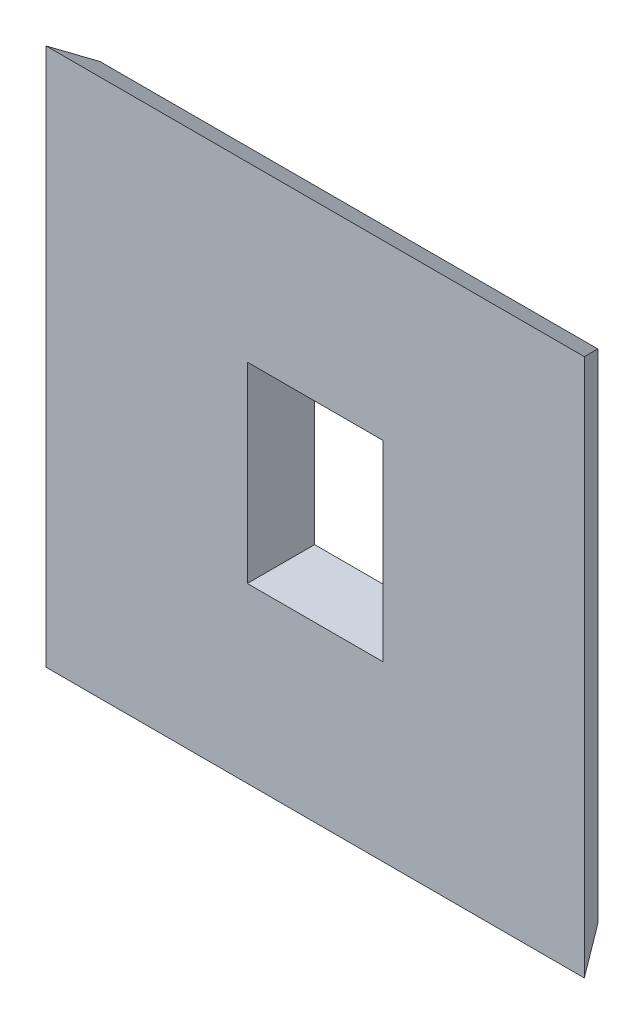
ISO-10303-21;
HEADER;
FILE_DESCRIPTION(('STEP AP214'),'2;1');
FILE_NAME('part.step','',(''),(''),'','','');
FILE_SCHEMA(('AUTOMOTIVE_DESIGN { 1 0 10303 214 1 1 1 1 }'));
ENDSEC;
DATA;
#1=APPLICATION_CONTEXT('core data for automotive mechanical design processes');
#2=APPLICATION_PROTOCOL_DEFINITION('international standard','automotive_design',2000,#1);
#3=PRODUCT_CONTEXT('',#1,'mechanical');
#4=PRODUCT('Part','Part','',(#3));
#5=PRODUCT_RELATED_PRODUCT_CATEGORY('part','',(#4));
#6=PRODUCT_DEFINITION_FORMATION('','',#4);
#7=PRODUCT_DEFINITION_CONTEXT('part definition',#1,'design');
#8=PRODUCT_DEFINITION('design','',#6,#7);
#9=PRODUCT_DEFINITION_SHAPE('','',#8);
#10=(LENGTH_UNIT() NAMED_UNIT(*) SI_UNIT(.MILLI.,.METRE.));
#11=(NAMED_UNIT(*) PLANE_ANGLE_UNIT() SI_UNIT($,.RADIAN.));
#12=(NAMED_UNIT(*) SI_UNIT($,.STERADIAN.) SOLID_ANGLE_UNIT());
#13=UNCERTAINTY_MEASURE_WITH_UNIT(LENGTH_MEASURE(1.E-05),#10,'distance_accuracy_value','');
#14=(GEOMETRIC_REPRESENTATION_CONTEXT(3) GLOBAL_UNCERTAINTY_ASSIGNED_CONTEXT((#13)) GLOBAL_UNIT_ASSIGNED_CONTEXT((#10,
#11,#12)) REPRESENTATION_CONTEXT('',''));
#15=CARTESIAN_POINT('',(0.,0.,0.));
#16=DIRECTION('',(0.,0.,1.));
#17=DIRECTION('',(1.,0.,0.));
#18=AXIS2_PLACEMENT_3D('',#15,#16,#17);
#19=CARTESIAN_POINT('',(-40.,0.,0.));
#20=DIRECTION('',(0.857492925712544,0.,0.514495755427527));
#21=DIRECTION('',(0.,-1.,0.));
#22=AXIS2_PLACEMENT_3D('',#19,#20,#21);
#23=PLANE('',#22);
#24=DIRECTION('',(-0.457495710997814,-0.457495710997814,0.762492851663023));
#25=VECTOR('',#24,1.);
#26=CARTESIAN_POINT('',(-31.6279069767442,-31.6279069767442,-13.953488372093));
#27=LINE('',#26,#25);
#28=CARTESIAN_POINT('',(-40.,-40.,0.));
#29=VERTEX_POINT('',#28);
#30=CARTESIAN_POINT('',(-37.,-37.,-5.));
#31=VERTEX_POINT('',#30);
#32=EDGE_CURVE('E13',#29,#31,#27,.F.);
#33=ORIENTED_EDGE('',*,*,#32,.F.);
#34=DIRECTION('',(0.,1.,0.));
#35=VECTOR('',#34,1.);
#36=CARTESIAN_POINT('',(-40.,0.,0.));
#37=LINE('',#36,#35);
#38=CARTESIAN_POINT('',(-40.,40.,0.));
#39=VERTEX_POINT('',#38);
#40=EDGE_CURVE('E200',#29,#39,#37,.T.);
#41=ORIENTED_EDGE('',*,*,#40,.T.);
#42=DIRECTION('',(0.457495710997814,-0.457495710997814,-0.762492851663023));
#43=VECTOR('',#42,1.);
#44=CARTESIAN_POINT('',(-31.6279069767442,31.6279069767442,-13.953488372093));
#45=LINE('',#44,#43);
#46=CARTESIAN_POINT('',(-37.,37.,-5.));
#47=VERTEX_POINT('',#46);
#48=EDGE_CURVE('E56',#39,#47,#45,.T.);
#49=ORIENTED_EDGE('',*,*,#48,.T.);
#50=DIRECTION('',(0.,1.,0.));
#51=VECTOR('',#50,1.);
#52=CARTESIAN_POINT('',(-37.,0.,-5.));
#53=LINE('',#52,#51);
#54=EDGE_CURVE('E163',#31,#47,#53,.T.);
#55=ORIENTED_EDGE('',*,*,#54,.F.);
#56=EDGE_LOOP('',(#33,#41,#49,#55));
#57=FACE_BOUND('',#56,.T.);
#58=ADVANCED_FACE('F47',(#57),#23,.F.);
#59=CARTESIAN_POINT('',(0.,40.,0.));
#60=DIRECTION('',(0.,-0.857492925712544,0.514495755427527));
#61=DIRECTION('',(-1.,0.,0.));
#62=AXIS2_PLACEMENT_3D('',#59,#60,#61);
#63=PLANE('',#62);
#64=ORIENTED_EDGE('',*,*,#48,.F.);
#65=DIRECTION('',(1.,0.,0.));
#66=VECTOR('',#65,1.);
#67=CARTESIAN_POINT('',(0.,40.,0.));
#68=LINE('',#67,#66);
#69=CARTESIAN_POINT('',(40.,40.,0.));
#70=VERTEX_POINT('',#69);
#71=EDGE_CURVE('E212',#39,#70,#68,.T.);
#72=ORIENTED_EDGE('',*,*,#71,.T.);
#73=DIRECTION('',(0.457495710997814,0.457495710997814,0.762492851663023));
#74=VECTOR('',#73,1.);
#75=CARTESIAN_POINT('',(31.6279069767442,31.6279069767442,-13.953488372093));
#76=LINE('',#75,#74);
#77=CARTESIAN_POINT('',(37.,37.,-5.));
#78=VERTEX_POINT('',#77);
#79=EDGE_CURVE('E71',#70,#78,#76,.F.);
#80=ORIENTED_EDGE('',*,*,#79,.T.);
#81=DIRECTION('',(1.,0.,0.));
#82=VECTOR('',#81,1.);
#83=CARTESIAN_POINT('',(0.,37.,-5.));
#84=LINE('',#83,#82);
#85=EDGE_CURVE('E169',#47,#78,#84,.T.);
#86=ORIENTED_EDGE('',*,*,#85,.F.);
#87=EDGE_LOOP('',(#64,#72,#80,#86));
#88=FACE_BOUND('',#87,.T.);
#89=ADVANCED_FACE('F202',(#88),#63,.F.);
#90=CARTESIAN_POINT('',(40.,0.,0.));
#91=DIRECTION('',(0.857492925712544,0.,-0.514495755427527));
#92=DIRECTION('',(0.,-1.,0.));
#93=AXIS2_PLACEMENT_3D('',#90,#91,#92);
#94=PLANE('',#93);
#95=ORIENTED_EDGE('',*,*,#79,.F.);
#96=DIRECTION('',(0.,1.,0.));
#97=VECTOR('',#96,1.);
#98=CARTESIAN_POINT('',(40.,0.,0.));
#99=LINE('',#98,#97);
#100=CARTESIAN_POINT('',(40.,-40.,0.));
#101=VERTEX_POINT('',#100);
#102=EDGE_CURVE('E218',#101,#70,#99,.T.);
#103=ORIENTED_EDGE('',*,*,#102,.F.);
#104=DIRECTION('',(-0.457495710997814,0.457495710997814,-0.762492851663023));
#105=VECTOR('',#104,1.);
#106=CARTESIAN_POINT('',(31.6279069767442,-31.6279069767442,-13.953488372093));
#107=LINE('',#106,#105);
#108=CARTESIAN_POINT('',(37.,-37.,-5.));
#109=VERTEX_POINT('',#108);
#110=EDGE_CURVE('E63',#101,#109,#107,.T.);
#111=ORIENTED_EDGE('',*,*,#110,.T.);
#112=DIRECTION('',(0.,-1.,0.));
#113=VECTOR('',#112,1.);
#114=CARTESIAN_POINT('',(37.,-37.,-5.));
#115=LINE('',#114,#113);
#116=EDGE_CURVE('E184',#78,#109,#115,.T.);
#117=ORIENTED_EDGE('',*,*,#116,.F.);
#118=EDGE_LOOP('',(#95,#103,#111,#117));
#119=FACE_BOUND('',#118,.T.);
#120=ADVANCED_FACE('F297',(#119),#94,.T.);
#121=CARTESIAN_POINT('',(0.,-40.,0.));
#122=DIRECTION('',(0.,-0.857492925712544,-0.514495755427527));
#123=DIRECTION('',(-1.,0.,0.));
#124=AXIS2_PLACEMENT_3D('',#121,#122,#123);
#125=PLANE('',#124);
#126=DIRECTION('',(1.,0.,0.));
#127=VECTOR('',#126,1.);
#128=CARTESIAN_POINT('',(0.,-40.,0.));
#129=LINE('',#128,#127);
#130=EDGE_CURVE('E208',#29,#101,#129,.T.);
#131=ORIENTED_EDGE('',*,*,#130,.F.);
#132=ORIENTED_EDGE('',*,*,#32,.T.);
#133=DIRECTION('',(-1.,0.,0.));
#134=VECTOR('',#133,1.);
#135=CARTESIAN_POINT('',(-37.,-37.,-5.));
#136=LINE('',#135,#134);
#137=EDGE_CURVE('E188',#109,#31,#136,.T.);
#138=ORIENTED_EDGE('',*,*,#137,.F.);
#139=ORIENTED_EDGE('',*,*,#110,.F.);
#140=EDGE_LOOP('',(#131,#132,#138,#139));
#141=FACE_BOUND('',#140,.T.);
#142=ADVANCED_FACE('F206',(#141),#125,.T.);
#143=CARTESIAN_POINT('',(0.,-29.9,-10.));
#144=DIRECTION('',(0.,-1.,0.));
#145=DIRECTION('',(0.,0.,-1.));
#146=AXIS2_PLACEMENT_3D('',#143,#144,#145);
#147=PLANE('',#146);
#148=DIRECTION('',(0.,0.,1.));
#149=VECTOR('',#148,1.);
#150=CARTESIAN_POINT('',(29.9,-29.9,-10.));
#151=LINE('',#150,#149);
#152=CARTESIAN_POINT('',(29.9,-29.9,-10.));
#153=VERTEX_POINT('',#152);
#154=CARTESIAN_POINT('',(29.9,-29.9,-5.));
#155=VERTEX_POINT('',#154);
#156=EDGE_CURVE('E155',#153,#155,#151,.T.);
#157=ORIENTED_EDGE('',*,*,#156,.T.);
#158=DIRECTION('',(1.,0.,0.));
#159=VECTOR('',#158,1.);
#160=CARTESIAN_POINT('',(0.,-29.9,-5.));
#161=LINE('',#160,#159);
#162=CARTESIAN_POINT('',(-29.9,-29.9,-5.));
#163=VERTEX_POINT('',#162);
#164=EDGE_CURVE('E139',#163,#155,#161,.T.);
#165=ORIENTED_EDGE('',*,*,#164,.F.);
#166=DIRECTION('',(0.,0.,1.));
#167=VECTOR('',#166,1.);
#168=CARTESIAN_POINT('',(-29.9,-29.9,-10.));
#169=LINE('',#168,#167);
#170=CARTESIAN_POINT('',(-29.9,-29.9,-10.));
#171=VERTEX_POINT('',#170);
#172=EDGE_CURVE('E153',#171,#163,#169,.T.);
#173=ORIENTED_EDGE('',*,*,#172,.F.);
#174=DIRECTION('',(1.,0.,0.));
#175=VECTOR('',#174,1.);
#176=CARTESIAN_POINT('',(0.,-29.9,-10.));
#177=LINE('',#176,#175);
#178=EDGE_CURVE('E256',#171,#153,#177,.T.);
#179=ORIENTED_EDGE('',*,*,#178,.T.);
#180=EDGE_LOOP('',(#157,#165,#173,#179));
#181=FACE_BOUND('',#180,.T.);
#182=ADVANCED_FACE('F151',(#181),#147,.T.);
#183=CARTESIAN_POINT('',(-29.9,0.,-10.));
#184=DIRECTION('',(1.,0.,0.));
#185=DIRECTION('',(0.,0.,-1.));
#186=AXIS2_PLACEMENT_3D('',#183,#184,#185);
#187=PLANE('',#186);
#188=DIRECTION('',(0.,1.,0.));
#189=VECTOR('',#188,1.);
#190=CARTESIAN_POINT('',(-29.9,0.,-5.));
#191=LINE('',#190,#189);
#192=CARTESIAN_POINT('',(-29.9,29.9,-5.));
#193=VERTEX_POINT('',#192);
#194=EDGE_CURVE('E136',#163,#193,#191,.T.);
#195=ORIENTED_EDGE('',*,*,#194,.T.);
#196=DIRECTION('',(0.,0.,1.));
#197=VECTOR('',#196,1.);
#198=CARTESIAN_POINT('',(-29.9,29.9,-10.));
#199=LINE('',#198,#197);
#200=CARTESIAN_POINT('',(-29.9,29.9,-10.));
#201=VERTEX_POINT('',#200);
#202=EDGE_CURVE('E164',#201,#193,#199,.T.);
#203=ORIENTED_EDGE('',*,*,#202,.F.);
#204=DIRECTION('',(0.,1.,0.));
#205=VECTOR('',#204,1.);
#206=CARTESIAN_POINT('',(-29.9,0.,-10.));
#207=LINE('',#206,#205);
#208=EDGE_CURVE('E160',#171,#201,#207,.T.);
#209=ORIENTED_EDGE('',*,*,#208,.F.);
#210=ORIENTED_EDGE('',*,*,#172,.T.);
#211=EDGE_LOOP('',(#195,#203,#209,#210));
#212=FACE_BOUND('',#211,.T.);
#213=ADVANCED_FACE('F159',(#212),#187,.F.);
#214=CARTESIAN_POINT('',(0.,29.9,-10.));
#215=DIRECTION('',(0.,-1.,0.));
#216=DIRECTION('',(0.,0.,-1.));
#217=AXIS2_PLACEMENT_3D('',#214,#215,#216);
#218=PLANE('',#217);
#219=DIRECTION('',(1.,0.,0.));
#220=VECTOR('',#219,1.);
#221=CARTESIAN_POINT('',(0.,29.9,-5.));
#222=LINE('',#221,#220);
#223=CARTESIAN_POINT('',(29.9,29.9,-5.));
#224=VERTEX_POINT('',#223);
#225=EDGE_CURVE('E142',#193,#224,#222,.T.);
#226=ORIENTED_EDGE('',*,*,#225,.T.);
#227=DIRECTION('',(0.,0.,1.));
#228=VECTOR('',#227,1.);
#229=CARTESIAN_POINT('',(29.9,29.9,-10.));
#230=LINE('',#229,#228);
#231=CARTESIAN_POINT('',(29.9,29.9,-10.));
#232=VERTEX_POINT('',#231);
#233=EDGE_CURVE('E171',#232,#224,#230,.T.);
#234=ORIENTED_EDGE('',*,*,#233,.F.);
#235=DIRECTION('',(1.,0.,0.));
#236=VECTOR('',#235,1.);
#237=CARTESIAN_POINT('',(0.,29.9,-10.));
#238=LINE('',#237,#236);
#239=EDGE_CURVE('E271',#201,#232,#238,.T.);
#240=ORIENTED_EDGE('',*,*,#239,.F.);
#241=ORIENTED_EDGE('',*,*,#202,.T.);
#242=EDGE_LOOP('',(#226,#234,#240,#241));
#243=FACE_BOUND('',#242,.T.);
#244=ADVANCED_FACE('F280',(#243),#218,.F.);
#245=CARTESIAN_POINT('',(29.9,0.,-10.));
#246=DIRECTION('',(1.,0.,0.));
#247=DIRECTION('',(0.,0.,-1.));
#248=AXIS2_PLACEMENT_3D('',#245,#246,#247);
#249=PLANE('',#248);
#250=ORIENTED_EDGE('',*,*,#233,.T.);
#251=DIRECTION('',(0.,1.,0.));
#252=VECTOR('',#251,1.);
#253=CARTESIAN_POINT('',(29.9,0.,-5.));
#254=LINE('',#253,#252);
#255=EDGE_CURVE('E157',#155,#224,#254,.T.);
#256=ORIENTED_EDGE('',*,*,#255,.F.);
#257=ORIENTED_EDGE('',*,*,#156,.F.);
#258=DIRECTION('',(0.,1.,0.));
#259=VECTOR('',#258,1.);
#260=CARTESIAN_POINT('',(29.9,0.,-10.));
#261=LINE('',#260,#259);
#262=EDGE_CURVE('E268',#153,#232,#261,.T.);
#263=ORIENTED_EDGE('',*,*,#262,.T.);
#264=EDGE_LOOP('',(#250,#256,#257,#263));
#265=FACE_BOUND('',#264,.T.);
#266=ADVANCED_FACE('F282',(#265),#249,.T.);
#267=CARTESIAN_POINT('',(0.,0.,-10.));
#268=DIRECTION('',(0.,0.,1.));
#269=DIRECTION('',(1.,0.,0.));
#270=AXIS2_PLACEMENT_3D('',#267,#268,#269);
#271=PLANE('',#270);
#272=DIRECTION('',(0.,1.,0.));
#273=VECTOR('',#272,1.);
#274=CARTESIAN_POINT('',(-10.1,0.,-10.));
#275=LINE('',#274,#273);
#276=CARTESIAN_POINT('',(-10.1,-14.25,-10.));
#277=VERTEX_POINT('',#276);
#278=CARTESIAN_POINT('',(-10.1,14.25,-10.));
#279=VERTEX_POINT('',#278);
#280=EDGE_CURVE('E235',#277,#279,#275,.T.);
#281=ORIENTED_EDGE('',*,*,#280,.F.);
#282=DIRECTION('',(1.,0.,0.));
#283=VECTOR('',#282,1.);
#284=CARTESIAN_POINT('',(0.,-14.25,-10.));
#285=LINE('',#284,#283);
#286=CARTESIAN_POINT('',(10.1,-14.25,-10.));
#287=VERTEX_POINT('',#286);
#288=EDGE_CURVE('E222',#277,#287,#285,.T.);
#289=ORIENTED_EDGE('',*,*,#288,.T.);
#290=DIRECTION('',(0.,1.,0.));
#291=VECTOR('',#290,1.);
#292=CARTESIAN_POINT('',(10.1,0.,-10.));
#293=LINE('',#292,#291);
#294=CARTESIAN_POINT('',(10.1,14.25,-10.));
#295=VERTEX_POINT('',#294);
#296=EDGE_CURVE('E226',#287,#295,#293,.T.);
#297=ORIENTED_EDGE('',*,*,#296,.T.);
#298=DIRECTION('',(1.,0.,0.));
#299=VECTOR('',#298,1.);
#300=CARTESIAN_POINT('',(0.,14.25,-10.));
#301=LINE('',#300,#299);
#302=EDGE_CURVE('E231',#279,#295,#301,.T.);
#303=ORIENTED_EDGE('',*,*,#302,.F.);
#304=EDGE_LOOP('',(#281,#289,#297,#303));
#305=FACE_BOUND('',#304,.T.);
#306=ORIENTED_EDGE('',*,*,#178,.F.);
#307=ORIENTED_EDGE('',*,*,#208,.T.);
#308=ORIENTED_EDGE('',*,*,#239,.T.);
#309=ORIENTED_EDGE('',*,*,#262,.F.);
#310=EDGE_LOOP('',(#306,#307,#308,#309));
#311=FACE_BOUND('',#310,.T.);
#312=ADVANCED_FACE('F278',(#305,#311),#271,.F.);
#313=CARTESIAN_POINT('',(0.,0.,0.));
#314=DIRECTION('',(0.,0.,1.));
#315=DIRECTION('',(1.,0.,0.));
#316=AXIS2_PLACEMENT_3D('',#313,#314,#315);
#317=PLANE('',#316);
#318=DIRECTION('',(1.,0.,0.));
#319=VECTOR('',#318,1.);
#320=CARTESIAN_POINT('',(0.,-14.25,0.));
#321=LINE('',#320,#319);
#322=CARTESIAN_POINT('',(-10.1,-14.25,0.));
#323=VERTEX_POINT('',#322);
#324=CARTESIAN_POINT('',(10.1,-14.25,0.));
#325=VERTEX_POINT('',#324);
#326=EDGE_CURVE('E239',#323,#325,#321,.T.);
#327=ORIENTED_EDGE('',*,*,#326,.F.);
#328=DIRECTION('',(0.,1.,0.));
#329=VECTOR('',#328,1.);
#330=CARTESIAN_POINT('',(-10.1,0.,0.));
#331=LINE('',#330,#329);
#332=CARTESIAN_POINT('',(-10.1,14.25,0.));
#333=VERTEX_POINT('',#332);
#334=EDGE_CURVE('E227',#323,#333,#331,.T.);
#335=ORIENTED_EDGE('',*,*,#334,.T.);
#336=DIRECTION('',(1.,0.,0.));
#337=VECTOR('',#336,1.);
#338=CARTESIAN_POINT('',(0.,14.25,0.));
#339=LINE('',#338,#337);
#340=CARTESIAN_POINT('',(10.1,14.25,0.));
#341=VERTEX_POINT('',#340);
#342=EDGE_CURVE('E246',#333,#341,#339,.T.);
#343=ORIENTED_EDGE('',*,*,#342,.T.);
#344=DIRECTION('',(0.,1.,0.));
#345=VECTOR('',#344,1.);
#346=CARTESIAN_POINT('',(10.1,0.,0.));
#347=LINE('',#346,#345);
#348=EDGE_CURVE('E242',#325,#341,#347,.T.);
#349=ORIENTED_EDGE('',*,*,#348,.F.);
#350=EDGE_LOOP('',(#327,#335,#343,#349));
#351=FACE_BOUND('',#350,.T.);
#352=ORIENTED_EDGE('',*,*,#130,.T.);
#353=ORIENTED_EDGE('',*,*,#102,.T.);
#354=ORIENTED_EDGE('',*,*,#71,.F.);
#355=ORIENTED_EDGE('',*,*,#40,.F.);
#356=EDGE_LOOP('',(#352,#353,#354,#355));
#357=FACE_BOUND('',#356,.T.);
#358=ADVANCED_FACE('F210',(#351,#357),#317,.T.);
#359=CARTESIAN_POINT('',(0.,-14.25,-10.));
#360=DIRECTION('',(0.,-1.,0.));
#361=DIRECTION('',(0.,0.,-1.));
#362=AXIS2_PLACEMENT_3D('',#359,#360,#361);
#363=PLANE('',#362);
#364=ORIENTED_EDGE('',*,*,#326,.T.);
#365=DIRECTION('',(0.,0.,1.));
#366=VECTOR('',#365,1.);
#367=CARTESIAN_POINT('',(10.1,-14.25,-10.));
#368=LINE('',#367,#366);
#369=EDGE_CURVE('E238',#287,#325,#368,.T.);
#370=ORIENTED_EDGE('',*,*,#369,.F.);
#371=ORIENTED_EDGE('',*,*,#288,.F.);
#372=DIRECTION('',(0.,0.,1.));
#373=VECTOR('',#372,1.);
#374=CARTESIAN_POINT('',(-10.1,-14.25,-10.));
#375=LINE('',#374,#373);
#376=EDGE_CURVE('E253',#277,#323,#375,.T.);
#377=ORIENTED_EDGE('',*,*,#376,.T.);
#378=EDGE_LOOP('',(#364,#370,#371,#377));
#379=FACE_BOUND('',#378,.T.);
#380=ADVANCED_FACE('F322',(#379),#363,.F.);
#381=CARTESIAN_POINT('',(-10.1,0.,-10.));
#382=DIRECTION('',(1.,0.,0.));
#383=DIRECTION('',(0.,0.,-1.));
#384=AXIS2_PLACEMENT_3D('',#381,#382,#383);
#385=PLANE('',#384);
#386=ORIENTED_EDGE('',*,*,#334,.F.);
#387=ORIENTED_EDGE('',*,*,#376,.F.);
#388=ORIENTED_EDGE('',*,*,#280,.T.);
#389=DIRECTION('',(0.,0.,1.));
#390=VECTOR('',#389,1.);
#391=CARTESIAN_POINT('',(-10.1,14.25,-10.));
#392=LINE('',#391,#390);
#393=EDGE_CURVE('E257',#279,#333,#392,.T.);
#394=ORIENTED_EDGE('',*,*,#393,.T.);
#395=EDGE_LOOP('',(#386,#387,#388,#394));
#396=FACE_BOUND('',#395,.T.);
#397=ADVANCED_FACE('F327',(#396),#385,.T.);
#398=CARTESIAN_POINT('',(0.,14.25,-10.));
#399=DIRECTION('',(0.,-1.,0.));
#400=DIRECTION('',(0.,0.,-1.));
#401=AXIS2_PLACEMENT_3D('',#398,#399,#400);
#402=PLANE('',#401);
#403=ORIENTED_EDGE('',*,*,#342,.F.);
#404=ORIENTED_EDGE('',*,*,#393,.F.);
#405=ORIENTED_EDGE('',*,*,#302,.T.);
#406=DIRECTION('',(0.,0.,1.));
#407=VECTOR('',#406,1.);
#408=CARTESIAN_POINT('',(10.1,14.25,-10.));
#409=LINE('',#408,#407);
#410=EDGE_CURVE('E260',#295,#341,#409,.T.);
#411=ORIENTED_EDGE('',*,*,#410,.T.);
#412=EDGE_LOOP('',(#403,#404,#405,#411));
#413=FACE_BOUND('',#412,.T.);
#414=ADVANCED_FACE('F332',(#413),#402,.T.);
#415=CARTESIAN_POINT('',(10.1,0.,-10.));
#416=DIRECTION('',(1.,0.,0.));
#417=DIRECTION('',(0.,0.,-1.));
#418=AXIS2_PLACEMENT_3D('',#415,#416,#417);
#419=PLANE('',#418);
#420=ORIENTED_EDGE('',*,*,#348,.T.);
#421=ORIENTED_EDGE('',*,*,#410,.F.);
#422=ORIENTED_EDGE('',*,*,#296,.F.);
#423=ORIENTED_EDGE('',*,*,#369,.T.);
#424=EDGE_LOOP('',(#420,#421,#422,#423));
#425=FACE_BOUND('',#424,.T.);
#426=ADVANCED_FACE('F329',(#425),#419,.F.);
#427=CARTESIAN_POINT('',(0.,0.,-5.));
#428=DIRECTION('',(0.,0.,1.));
#429=DIRECTION('',(1.,0.,0.));
#430=AXIS2_PLACEMENT_3D('',#427,#428,#429);
#431=PLANE('',#430);
#432=ORIENTED_EDGE('',*,*,#116,.T.);
#433=ORIENTED_EDGE('',*,*,#137,.T.);
#434=ORIENTED_EDGE('',*,*,#54,.T.);
#435=ORIENTED_EDGE('',*,*,#85,.T.);
#436=EDGE_LOOP('',(#432,#433,#434,#435));
#437=FACE_BOUND('',#436,.T.);
#438=ORIENTED_EDGE('',*,*,#255,.T.);
#439=ORIENTED_EDGE('',*,*,#225,.F.);
#440=ORIENTED_EDGE('',*,*,#194,.F.);
#441=ORIENTED_EDGE('',*,*,#164,.T.);
#442=EDGE_LOOP('',(#438,#439,#440,#441));
#443=FACE_BOUND('',#442,.T.);
#444=ADVANCED_FACE('F138',(#437,#443),#431,.F.);
#445=CLOSED_SHELL('',(#58,#89,#120,#142,#182,#213,#244,#266,#312,#358,#380,#397,#414,#426,#444));
#446=MANIFOLD_SOLID_BREP('B2',#445);
#447=ADVANCED_BREP_SHAPE_REPRESENTATION('',(#18,#446),#14);
#448=SHAPE_DEFINITION_REPRESENTATION(#9,#447);
ENDSEC;
END-ISO-10303-21;
